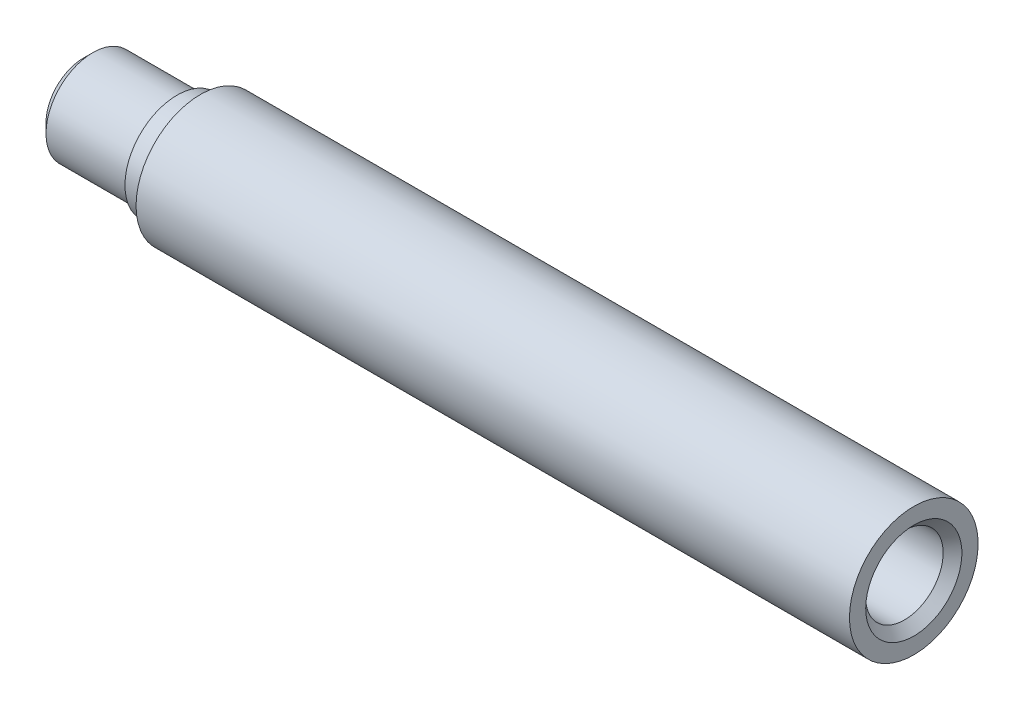
ISO-10303-21;
HEADER;
FILE_DESCRIPTION(('STEP AP214'),'2;1');
FILE_NAME('part.step','',(''),(''),'','','');
FILE_SCHEMA(('AUTOMOTIVE_DESIGN { 1 0 10303 214 1 1 1 1 }'));
ENDSEC;
DATA;
#1=APPLICATION_CONTEXT('core data for automotive mechanical design processes');
#2=APPLICATION_PROTOCOL_DEFINITION('international standard','automotive_design',2000,#1);
#3=PRODUCT_CONTEXT('',#1,'mechanical');
#4=PRODUCT('Part','Part','',(#3));
#5=PRODUCT_RELATED_PRODUCT_CATEGORY('part','',(#4));
#6=PRODUCT_DEFINITION_FORMATION('','',#4);
#7=PRODUCT_DEFINITION_CONTEXT('part definition',#1,'design');
#8=PRODUCT_DEFINITION('design','',#6,#7);
#9=PRODUCT_DEFINITION_SHAPE('','',#8);
#10=(LENGTH_UNIT() NAMED_UNIT(*) SI_UNIT(.MILLI.,.METRE.));
#11=(NAMED_UNIT(*) PLANE_ANGLE_UNIT() SI_UNIT($,.RADIAN.));
#12=(NAMED_UNIT(*) SI_UNIT($,.STERADIAN.) SOLID_ANGLE_UNIT());
#13=UNCERTAINTY_MEASURE_WITH_UNIT(LENGTH_MEASURE(1.E-05),#10,'distance_accuracy_value','');
#14=(GEOMETRIC_REPRESENTATION_CONTEXT(3) GLOBAL_UNCERTAINTY_ASSIGNED_CONTEXT((#13)) GLOBAL_UNIT_ASSIGNED_CONTEXT((#10,
#11,#12)) REPRESENTATION_CONTEXT('',''));
#15=CARTESIAN_POINT('',(0.,0.,0.));
#16=DIRECTION('',(0.,0.,1.));
#17=DIRECTION('',(1.,0.,0.));
#18=AXIS2_PLACEMENT_3D('',#15,#16,#17);
#19=CARTESIAN_POINT('',(35.,0.,0.));
#20=DIRECTION('',(-1.,0.,0.));
#21=DIRECTION('',(0.,0.,1.));
#22=AXIS2_PLACEMENT_3D('',#19,#20,#21);
#23=CYLINDRICAL_SURFACE('',#22,3.311374294);
#24=CARTESIAN_POINT('',(19.,0.,0.));
#25=DIRECTION('',(-1.,0.,0.));
#26=DIRECTION('',(0.,0.,1.));
#27=AXIS2_PLACEMENT_3D('',#24,#25,#26);
#28=CIRCLE('',#27,3.311374294);
#29=CARTESIAN_POINT('',(19.,0.,3.311374294));
#30=VERTEX_POINT('',#29);
#31=EDGE_CURVE('E11',#30,#30,#28,.T.);
#32=ORIENTED_EDGE('',*,*,#31,.T.);
#33=EDGE_LOOP('',(#32));
#34=FACE_BOUND('',#33,.T.);
#35=CARTESIAN_POINT('',(34.2,0.,0.));
#36=DIRECTION('',(-1.,0.,0.));
#37=DIRECTION('',(0.,0.,1.));
#38=AXIS2_PLACEMENT_3D('',#35,#36,#37);
#39=CIRCLE('',#38,3.311374294);
#40=CARTESIAN_POINT('',(34.2,0.,3.311374294));
#41=VERTEX_POINT('',#40);
#42=EDGE_CURVE('E53',#41,#41,#39,.T.);
#43=ORIENTED_EDGE('',*,*,#42,.F.);
#44=EDGE_LOOP('',(#43));
#45=FACE_BOUND('',#44,.T.);
#46=ADVANCED_FACE('F34',(#34,#45),#23,.F.);
#47=CARTESIAN_POINT('',(19.,0.,0.));
#48=DIRECTION('',(1.,0.,0.));
#49=DIRECTION('',(0.,0.,-1.));
#50=AXIS2_PLACEMENT_3D('',#47,#48,#49);
#51=CONICAL_SURFACE('',#50,3.311374294,1.02974425870434);
#52=CARTESIAN_POINT('',(17.010325592,0.,0.));
#53=VERTEX_POINT('',#52);
#54=VERTEX_LOOP('',#53);
#55=FACE_BOUND('',#54,.T.);
#56=ORIENTED_EDGE('',*,*,#31,.F.);
#57=EDGE_LOOP('',(#56));
#58=FACE_BOUND('',#57,.T.);
#59=ADVANCED_FACE('F43',(#55,#58),#51,.F.);
#60=CARTESIAN_POINT('',(-36.,0.,0.));
#61=DIRECTION('',(-1.,0.,0.));
#62=DIRECTION('',(0.,0.,1.));
#63=AXIS2_PLACEMENT_3D('',#60,#61,#62);
#64=PLANE('',#63);
#65=CARTESIAN_POINT('',(-36.,0.,0.));
#66=DIRECTION('',(-1.,0.,0.));
#67=DIRECTION('',(0.,0.,1.));
#68=AXIS2_PLACEMENT_3D('',#65,#66,#67);
#69=CIRCLE('',#68,3.19999999999997);
#70=CARTESIAN_POINT('',(-36.,0.,3.19999999999997));
#71=VERTEX_POINT('',#70);
#72=EDGE_CURVE('E40',#71,#71,#69,.T.);
#73=ORIENTED_EDGE('',*,*,#72,.T.);
#74=EDGE_LOOP('',(#73));
#75=FACE_BOUND('',#74,.T.);
#76=ADVANCED_FACE('F46',(#75),#64,.T.);
#77=CARTESIAN_POINT('',(-36.,0.,0.));
#78=DIRECTION('',(1.,0.,0.));
#79=DIRECTION('',(0.,0.,-1.));
#80=AXIS2_PLACEMENT_3D('',#77,#78,#79);
#81=CONICAL_SURFACE('',#80,3.19999999999997,0.785398163397451);
#82=CARTESIAN_POINT('',(-35.2,0.,0.));
#83=DIRECTION('',(-1.,0.,0.));
#84=DIRECTION('',(0.,0.,1.));
#85=AXIS2_PLACEMENT_3D('',#82,#83,#84);
#86=CIRCLE('',#85,4.);
#87=CARTESIAN_POINT('',(-35.2,0.,4.));
#88=VERTEX_POINT('',#87);
#89=EDGE_CURVE('E75',#88,#88,#86,.T.);
#90=ORIENTED_EDGE('',*,*,#89,.T.);
#91=EDGE_LOOP('',(#90));
#92=FACE_BOUND('',#91,.T.);
#93=ORIENTED_EDGE('',*,*,#72,.F.);
#94=EDGE_LOOP('',(#93));
#95=FACE_BOUND('',#94,.T.);
#96=ADVANCED_FACE('F81',(#92,#95),#81,.T.);
#97=CARTESIAN_POINT('',(35.,0.,0.));
#98=DIRECTION('',(-1.,0.,0.));
#99=DIRECTION('',(0.,0.,1.));
#100=AXIS2_PLACEMENT_3D('',#97,#98,#99);
#101=CYLINDRICAL_SURFACE('',#100,4.);
#102=CARTESIAN_POINT('',(-28.,0.,0.));
#103=DIRECTION('',(-1.,0.,0.));
#104=DIRECTION('',(0.,0.,1.));
#105=AXIS2_PLACEMENT_3D('',#102,#103,#104);
#106=CIRCLE('',#105,4.);
#107=CARTESIAN_POINT('',(-28.,0.,4.));
#108=VERTEX_POINT('',#107);
#109=EDGE_CURVE('E72',#108,#108,#106,.T.);
#110=ORIENTED_EDGE('',*,*,#109,.T.);
#111=EDGE_LOOP('',(#110));
#112=FACE_BOUND('',#111,.T.);
#113=ORIENTED_EDGE('',*,*,#89,.F.);
#114=EDGE_LOOP('',(#113));
#115=FACE_BOUND('',#114,.T.);
#116=ADVANCED_FACE('F83',(#112,#115),#101,.T.);
#117=CARTESIAN_POINT('',(-28.,4.,0.));
#118=DIRECTION('',(-1.,0.,0.));
#119=DIRECTION('',(0.,0.,1.));
#120=AXIS2_PLACEMENT_3D('',#117,#118,#119);
#121=PLANE('',#120);
#122=CARTESIAN_POINT('',(-28.,0.,0.));
#123=DIRECTION('',(-1.,0.,0.));
#124=DIRECTION('',(0.,0.,1.));
#125=AXIS2_PLACEMENT_3D('',#122,#123,#124);
#126=CIRCLE('',#125,4.45);
#127=CARTESIAN_POINT('',(-28.,0.,4.45));
#128=VERTEX_POINT('',#127);
#129=EDGE_CURVE('E69',#128,#128,#126,.T.);
#130=ORIENTED_EDGE('',*,*,#129,.T.);
#131=EDGE_LOOP('',(#130));
#132=FACE_BOUND('',#131,.T.);
#133=ORIENTED_EDGE('',*,*,#109,.F.);
#134=EDGE_LOOP('',(#133));
#135=FACE_BOUND('',#134,.T.);
#136=ADVANCED_FACE('F90',(#132,#135),#121,.T.);
#137=CARTESIAN_POINT('',(35.,0.,0.));
#138=DIRECTION('',(-1.,0.,0.));
#139=DIRECTION('',(0.,0.,1.));
#140=AXIS2_PLACEMENT_3D('',#137,#138,#139);
#141=CYLINDRICAL_SURFACE('',#140,4.45);
#142=CARTESIAN_POINT('',(-26.,0.,0.));
#143=DIRECTION('',(-1.,0.,0.));
#144=DIRECTION('',(0.,0.,1.));
#145=AXIS2_PLACEMENT_3D('',#142,#143,#144);
#146=CIRCLE('',#145,4.45);
#147=CARTESIAN_POINT('',(-26.,0.,4.45));
#148=VERTEX_POINT('',#147);
#149=EDGE_CURVE('E66',#148,#148,#146,.T.);
#150=ORIENTED_EDGE('',*,*,#149,.T.);
#151=EDGE_LOOP('',(#150));
#152=FACE_BOUND('',#151,.T.);
#153=ORIENTED_EDGE('',*,*,#129,.F.);
#154=EDGE_LOOP('',(#153));
#155=FACE_BOUND('',#154,.T.);
#156=ADVANCED_FACE('F97',(#152,#155),#141,.T.);
#157=CARTESIAN_POINT('',(-26.,4.45,0.));
#158=DIRECTION('',(-1.,0.,0.));
#159=DIRECTION('',(0.,0.,1.));
#160=AXIS2_PLACEMENT_3D('',#157,#158,#159);
#161=PLANE('',#160);
#162=CARTESIAN_POINT('',(-26.,0.,0.));
#163=DIRECTION('',(-1.,0.,0.));
#164=DIRECTION('',(0.,0.,1.));
#165=AXIS2_PLACEMENT_3D('',#162,#163,#164);
#166=CIRCLE('',#165,5.5);
#167=CARTESIAN_POINT('',(-26.,0.,5.5));
#168=VERTEX_POINT('',#167);
#169=EDGE_CURVE('E63',#168,#168,#166,.T.);
#170=ORIENTED_EDGE('',*,*,#169,.T.);
#171=EDGE_LOOP('',(#170));
#172=FACE_BOUND('',#171,.T.);
#173=ORIENTED_EDGE('',*,*,#149,.F.);
#174=EDGE_LOOP('',(#173));
#175=FACE_BOUND('',#174,.T.);
#176=ADVANCED_FACE('F101',(#172,#175),#161,.T.);
#177=CARTESIAN_POINT('',(35.,0.,0.));
#178=DIRECTION('',(-1.,0.,0.));
#179=DIRECTION('',(0.,0.,1.));
#180=AXIS2_PLACEMENT_3D('',#177,#178,#179);
#181=CYLINDRICAL_SURFACE('',#180,5.5);
#182=CARTESIAN_POINT('',(35.,0.,0.));
#183=DIRECTION('',(-1.,0.,0.));
#184=DIRECTION('',(0.,0.,1.));
#185=AXIS2_PLACEMENT_3D('',#182,#183,#184);
#186=CIRCLE('',#185,5.49999999999999);
#187=CARTESIAN_POINT('',(35.,0.,5.49999999999999));
#188=VERTEX_POINT('',#187);
#189=EDGE_CURVE('E58',#188,#188,#186,.T.);
#190=ORIENTED_EDGE('',*,*,#189,.T.);
#191=EDGE_LOOP('',(#190));
#192=FACE_BOUND('',#191,.T.);
#193=ORIENTED_EDGE('',*,*,#169,.F.);
#194=EDGE_LOOP('',(#193));
#195=FACE_BOUND('',#194,.T.);
#196=ADVANCED_FACE('F105',(#192,#195),#181,.T.);
#197=CARTESIAN_POINT('',(35.,5.49999999999999,0.));
#198=DIRECTION('',(1.,0.,0.));
#199=DIRECTION('',(0.,0.,-1.));
#200=AXIS2_PLACEMENT_3D('',#197,#198,#199);
#201=PLANE('',#200);
#202=CARTESIAN_POINT('',(35.,0.,0.));
#203=DIRECTION('',(-1.,0.,0.));
#204=DIRECTION('',(0.,0.,1.));
#205=AXIS2_PLACEMENT_3D('',#202,#203,#204);
#206=CIRCLE('',#205,4.11137429400003);
#207=CARTESIAN_POINT('',(35.,0.,4.11137429400003));
#208=VERTEX_POINT('',#207);
#209=EDGE_CURVE('E55',#208,#208,#206,.T.);
#210=ORIENTED_EDGE('',*,*,#209,.T.);
#211=EDGE_LOOP('',(#210));
#212=FACE_BOUND('',#211,.T.);
#213=ORIENTED_EDGE('',*,*,#189,.F.);
#214=EDGE_LOOP('',(#213));
#215=FACE_BOUND('',#214,.T.);
#216=ADVANCED_FACE('F109',(#212,#215),#201,.T.);
#217=CARTESIAN_POINT('',(35.,0.,0.));
#218=DIRECTION('',(1.,0.,0.));
#219=DIRECTION('',(0.,0.,-1.));
#220=AXIS2_PLACEMENT_3D('',#217,#218,#219);
#221=CONICAL_SURFACE('',#220,4.11137429400003,0.785398163397447);
#222=ORIENTED_EDGE('',*,*,#42,.T.);
#223=EDGE_LOOP('',(#222));
#224=FACE_BOUND('',#223,.T.);
#225=ORIENTED_EDGE('',*,*,#209,.F.);
#226=EDGE_LOOP('',(#225));
#227=FACE_BOUND('',#226,.T.);
#228=ADVANCED_FACE('F113',(#224,#227),#221,.F.);
#229=CLOSED_SHELL('',(#46,#59,#76,#96,#116,#136,#156,#176,#196,#216,#228));
#230=MANIFOLD_SOLID_BREP('B2',#229);
#231=ADVANCED_BREP_SHAPE_REPRESENTATION('',(#18,#230),#14);
#232=SHAPE_DEFINITION_REPRESENTATION(#9,#231);
ENDSEC;
END-ISO-10303-21;
